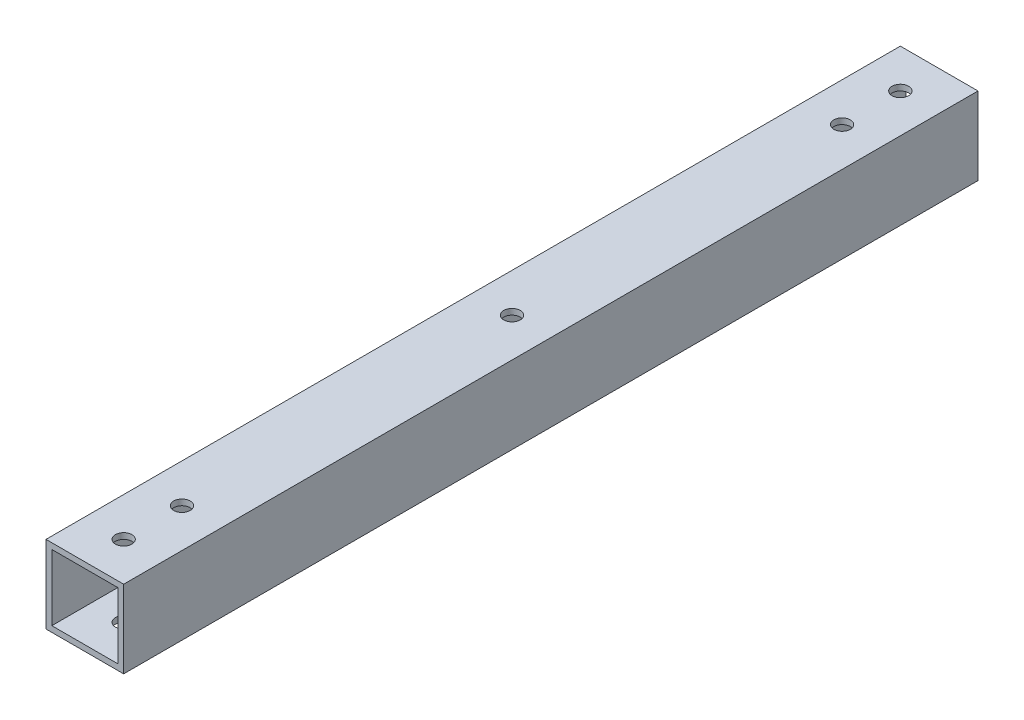
ISO-10303-21;
HEADER;
FILE_DESCRIPTION(('STEP AP214'),'2;1');
FILE_NAME('part.step','',(''),(''),'','','');
FILE_SCHEMA(('AUTOMOTIVE_DESIGN { 1 0 10303 214 1 1 1 1 }'));
ENDSEC;
DATA;
#1=APPLICATION_CONTEXT('core data for automotive mechanical design processes');
#2=APPLICATION_PROTOCOL_DEFINITION('international standard','automotive_design',2000,#1);
#3=PRODUCT_CONTEXT('',#1,'mechanical');
#4=PRODUCT('Part','Part','',(#3));
#5=PRODUCT_RELATED_PRODUCT_CATEGORY('part','',(#4));
#6=PRODUCT_DEFINITION_FORMATION('','',#4);
#7=PRODUCT_DEFINITION_CONTEXT('part definition',#1,'design');
#8=PRODUCT_DEFINITION('design','',#6,#7);
#9=PRODUCT_DEFINITION_SHAPE('','',#8);
#10=(LENGTH_UNIT() NAMED_UNIT(*) SI_UNIT(.MILLI.,.METRE.));
#11=(NAMED_UNIT(*) PLANE_ANGLE_UNIT() SI_UNIT($,.RADIAN.));
#12=(NAMED_UNIT(*) SI_UNIT($,.STERADIAN.) SOLID_ANGLE_UNIT());
#13=UNCERTAINTY_MEASURE_WITH_UNIT(LENGTH_MEASURE(1.E-05),#10,'distance_accuracy_value','');
#14=(GEOMETRIC_REPRESENTATION_CONTEXT(3) GLOBAL_UNCERTAINTY_ASSIGNED_CONTEXT((#13)) GLOBAL_UNIT_ASSIGNED_CONTEXT((#10,
#11,#12)) REPRESENTATION_CONTEXT('',''));
#15=CARTESIAN_POINT('',(0.,0.,0.));
#16=DIRECTION('',(0.,0.,1.));
#17=DIRECTION('',(1.,0.,0.));
#18=AXIS2_PLACEMENT_3D('',#15,#16,#17);
#19=CARTESIAN_POINT('',(10.,-9.99999999999999,-220.));
#20=DIRECTION('',(1.,0.,0.));
#21=DIRECTION('',(0.,0.,-1.));
#22=AXIS2_PLACEMENT_3D('',#19,#20,#21);
#23=PLANE('',#22);
#24=DIRECTION('',(0.,1.,0.));
#25=VECTOR('',#24,1.);
#26=CARTESIAN_POINT('',(10.,-9.99999999999999,0.));
#27=LINE('',#26,#25);
#28=CARTESIAN_POINT('',(10.,-9.99999999999999,0.));
#29=VERTEX_POINT('',#28);
#30=CARTESIAN_POINT('',(10.,10.,0.));
#31=VERTEX_POINT('',#30);
#32=EDGE_CURVE('E142',#29,#31,#27,.T.);
#33=ORIENTED_EDGE('',*,*,#32,.F.);
#34=DIRECTION('',(0.,0.,1.));
#35=VECTOR('',#34,1.);
#36=CARTESIAN_POINT('',(10.,-9.99999999999999,-220.));
#37=LINE('',#36,#35);
#38=CARTESIAN_POINT('',(10.,-9.99999999999999,-220.));
#39=VERTEX_POINT('',#38);
#40=EDGE_CURVE('E11',#39,#29,#37,.T.);
#41=ORIENTED_EDGE('',*,*,#40,.F.);
#42=DIRECTION('',(0.,1.,0.));
#43=VECTOR('',#42,1.);
#44=CARTESIAN_POINT('',(10.,-9.99999999999999,-220.));
#45=LINE('',#44,#43);
#46=CARTESIAN_POINT('',(10.,10.,-220.));
#47=VERTEX_POINT('',#46);
#48=EDGE_CURVE('E146',#39,#47,#45,.T.);
#49=ORIENTED_EDGE('',*,*,#48,.T.);
#50=DIRECTION('',(0.,0.,1.));
#51=VECTOR('',#50,1.);
#52=CARTESIAN_POINT('',(10.,10.,-220.));
#53=LINE('',#52,#51);
#54=EDGE_CURVE('E159',#47,#31,#53,.T.);
#55=ORIENTED_EDGE('',*,*,#54,.T.);
#56=EDGE_LOOP('',(#33,#41,#49,#55));
#57=FACE_BOUND('',#56,.T.);
#58=ADVANCED_FACE('F41',(#57),#23,.T.);
#59=CARTESIAN_POINT('',(-9.99999999999998,-9.99999999999999,-220.));
#60=DIRECTION('',(0.,-1.,0.));
#61=DIRECTION('',(0.,0.,-1.));
#62=AXIS2_PLACEMENT_3D('',#59,#60,#61);
#63=PLANE('',#62);
#64=CARTESIAN_POINT('',(0.,-9.99999999999999,-10.));
#65=DIRECTION('',(0.,1.,0.));
#66=DIRECTION('',(0.,0.,1.));
#67=AXIS2_PLACEMENT_3D('',#64,#65,#66);
#68=CIRCLE('',#67,2.125);
#69=CARTESIAN_POINT('',(0.,-9.99999999999999,-7.875));
#70=VERTEX_POINT('',#69);
#71=EDGE_CURVE('E178',#70,#70,#68,.T.);
#72=ORIENTED_EDGE('',*,*,#71,.T.);
#73=EDGE_LOOP('',(#72));
#74=FACE_BOUND('',#73,.T.);
#75=CARTESIAN_POINT('',(0.,-9.99999999999999,-195.));
#76=DIRECTION('',(0.,1.,0.));
#77=DIRECTION('',(0.,0.,-1.));
#78=AXIS2_PLACEMENT_3D('',#75,#76,#77);
#79=CIRCLE('',#78,2.125);
#80=CARTESIAN_POINT('',(0.,-9.99999999999999,-197.125));
#81=VERTEX_POINT('',#80);
#82=EDGE_CURVE('E215',#81,#81,#79,.T.);
#83=ORIENTED_EDGE('',*,*,#82,.T.);
#84=EDGE_LOOP('',(#83));
#85=FACE_BOUND('',#84,.T.);
#86=CARTESIAN_POINT('',(0.,-9.99999999999999,-25.));
#87=DIRECTION('',(0.,1.,0.));
#88=DIRECTION('',(0.,0.,1.));
#89=AXIS2_PLACEMENT_3D('',#86,#87,#88);
#90=CIRCLE('',#89,2.125);
#91=CARTESIAN_POINT('',(0.,-9.99999999999999,-22.875));
#92=VERTEX_POINT('',#91);
#93=EDGE_CURVE('E221',#92,#92,#90,.T.);
#94=ORIENTED_EDGE('',*,*,#93,.T.);
#95=EDGE_LOOP('',(#94));
#96=FACE_BOUND('',#95,.T.);
#97=CARTESIAN_POINT('',(-6.86049799777153E-13,-9.99999999999999,-210.));
#98=DIRECTION('',(0.,1.,0.));
#99=DIRECTION('',(0.,0.,1.));
#100=AXIS2_PLACEMENT_3D('',#97,#98,#99);
#101=CIRCLE('',#100,2.125);
#102=CARTESIAN_POINT('',(-6.86049799777153E-13,-9.99999999999999,-207.875));
#103=VERTEX_POINT('',#102);
#104=EDGE_CURVE('E201',#103,#103,#101,.T.);
#105=ORIENTED_EDGE('',*,*,#104,.T.);
#106=EDGE_LOOP('',(#105));
#107=FACE_BOUND('',#106,.T.);
#108=CARTESIAN_POINT('',(-3.43024899888577E-13,-9.99999999999999,-110.));
#109=DIRECTION('',(0.,1.,0.));
#110=DIRECTION('',(0.,0.,1.));
#111=AXIS2_PLACEMENT_3D('',#108,#109,#110);
#112=CIRCLE('',#111,2.125);
#113=CARTESIAN_POINT('',(-3.43024899888577E-13,-9.99999999999999,-107.875));
#114=VERTEX_POINT('',#113);
#115=EDGE_CURVE('E208',#114,#114,#112,.T.);
#116=ORIENTED_EDGE('',*,*,#115,.T.);
#117=EDGE_LOOP('',(#116));
#118=FACE_BOUND('',#117,.T.);
#119=DIRECTION('',(1.,0.,0.));
#120=VECTOR('',#119,1.);
#121=CARTESIAN_POINT('',(-9.99999999999998,-9.99999999999999,0.));
#122=LINE('',#121,#120);
#123=CARTESIAN_POINT('',(-9.99999999999998,-9.99999999999999,0.));
#124=VERTEX_POINT('',#123);
#125=EDGE_CURVE('E150',#124,#29,#122,.T.);
#126=ORIENTED_EDGE('',*,*,#125,.F.);
#127=DIRECTION('',(0.,0.,1.));
#128=VECTOR('',#127,1.);
#129=CARTESIAN_POINT('',(-9.99999999999998,-9.99999999999999,-220.));
#130=LINE('',#129,#128);
#131=CARTESIAN_POINT('',(-9.99999999999998,-9.99999999999999,-220.));
#132=VERTEX_POINT('',#131);
#133=EDGE_CURVE('E49',#132,#124,#130,.T.);
#134=ORIENTED_EDGE('',*,*,#133,.F.);
#135=DIRECTION('',(1.,0.,0.));
#136=VECTOR('',#135,1.);
#137=CARTESIAN_POINT('',(-9.99999999999998,-9.99999999999999,-220.));
#138=LINE('',#137,#136);
#139=EDGE_CURVE('E156',#132,#39,#138,.T.);
#140=ORIENTED_EDGE('',*,*,#139,.T.);
#141=ORIENTED_EDGE('',*,*,#40,.T.);
#142=EDGE_LOOP('',(#126,#134,#140,#141));
#143=FACE_BOUND('',#142,.T.);
#144=ADVANCED_FACE('F231',(#74,#85,#96,#107,#118,#143),#63,.T.);
#145=CARTESIAN_POINT('',(-9.99999999999998,-9.99999999999999,-220.));
#146=DIRECTION('',(-1.,0.,0.));
#147=DIRECTION('',(0.,0.,1.));
#148=AXIS2_PLACEMENT_3D('',#145,#146,#147);
#149=PLANE('',#148);
#150=DIRECTION('',(0.,-1.,0.));
#151=VECTOR('',#150,1.);
#152=CARTESIAN_POINT('',(-9.99999999999998,-9.99999999999999,0.));
#153=LINE('',#152,#151);
#154=CARTESIAN_POINT('',(-9.99999999999998,10.,0.));
#155=VERTEX_POINT('',#154);
#156=EDGE_CURVE('E165',#155,#124,#153,.T.);
#157=ORIENTED_EDGE('',*,*,#156,.F.);
#158=DIRECTION('',(0.,0.,1.));
#159=VECTOR('',#158,1.);
#160=CARTESIAN_POINT('',(-9.99999999999998,10.,-220.));
#161=LINE('',#160,#159);
#162=CARTESIAN_POINT('',(-9.99999999999998,10.,-220.));
#163=VERTEX_POINT('',#162);
#164=EDGE_CURVE('E171',#163,#155,#161,.T.);
#165=ORIENTED_EDGE('',*,*,#164,.F.);
#166=DIRECTION('',(0.,-1.,0.));
#167=VECTOR('',#166,1.);
#168=CARTESIAN_POINT('',(-9.99999999999998,-9.99999999999999,-220.));
#169=LINE('',#168,#167);
#170=EDGE_CURVE('E153',#163,#132,#169,.T.);
#171=ORIENTED_EDGE('',*,*,#170,.T.);
#172=ORIENTED_EDGE('',*,*,#133,.T.);
#173=EDGE_LOOP('',(#157,#165,#171,#172));
#174=FACE_BOUND('',#173,.T.);
#175=ADVANCED_FACE('F266',(#174),#149,.T.);
#176=CARTESIAN_POINT('',(-9.99999999999998,10.,-220.));
#177=DIRECTION('',(0.,1.,0.));
#178=DIRECTION('',(0.,0.,1.));
#179=AXIS2_PLACEMENT_3D('',#176,#177,#178);
#180=PLANE('',#179);
#181=CARTESIAN_POINT('',(0.,10.,-10.));
#182=DIRECTION('',(0.,1.,0.));
#183=DIRECTION('',(0.,0.,1.));
#184=AXIS2_PLACEMENT_3D('',#181,#182,#183);
#185=CIRCLE('',#184,2.125);
#186=CARTESIAN_POINT('',(0.,10.,-7.875));
#187=VERTEX_POINT('',#186);
#188=EDGE_CURVE('E214',#187,#187,#185,.T.);
#189=ORIENTED_EDGE('',*,*,#188,.F.);
#190=EDGE_LOOP('',(#189));
#191=FACE_BOUND('',#190,.T.);
#192=CARTESIAN_POINT('',(0.,10.,-195.));
#193=DIRECTION('',(0.,1.,0.));
#194=DIRECTION('',(0.,0.,-1.));
#195=AXIS2_PLACEMENT_3D('',#192,#193,#194);
#196=CIRCLE('',#195,2.125);
#197=CARTESIAN_POINT('',(0.,10.,-197.125));
#198=VERTEX_POINT('',#197);
#199=EDGE_CURVE('E218',#198,#198,#196,.T.);
#200=ORIENTED_EDGE('',*,*,#199,.F.);
#201=EDGE_LOOP('',(#200));
#202=FACE_BOUND('',#201,.T.);
#203=CARTESIAN_POINT('',(0.,10.,-25.));
#204=DIRECTION('',(0.,1.,0.));
#205=DIRECTION('',(0.,0.,1.));
#206=AXIS2_PLACEMENT_3D('',#203,#204,#205);
#207=CIRCLE('',#206,2.125);
#208=CARTESIAN_POINT('',(0.,10.,-22.875));
#209=VERTEX_POINT('',#208);
#210=EDGE_CURVE('E205',#209,#209,#207,.T.);
#211=ORIENTED_EDGE('',*,*,#210,.F.);
#212=EDGE_LOOP('',(#211));
#213=FACE_BOUND('',#212,.T.);
#214=CARTESIAN_POINT('',(-6.86049799777153E-13,10.,-210.));
#215=DIRECTION('',(0.,1.,0.));
#216=DIRECTION('',(0.,0.,1.));
#217=AXIS2_PLACEMENT_3D('',#214,#215,#216);
#218=CIRCLE('',#217,2.125);
#219=CARTESIAN_POINT('',(-6.86049799777153E-13,10.,-207.875));
#220=VERTEX_POINT('',#219);
#221=EDGE_CURVE('E204',#220,#220,#218,.T.);
#222=ORIENTED_EDGE('',*,*,#221,.F.);
#223=EDGE_LOOP('',(#222));
#224=FACE_BOUND('',#223,.T.);
#225=CARTESIAN_POINT('',(-3.43024899888577E-13,10.,-110.));
#226=DIRECTION('',(0.,1.,0.));
#227=DIRECTION('',(0.,0.,1.));
#228=AXIS2_PLACEMENT_3D('',#225,#226,#227);
#229=CIRCLE('',#228,2.125);
#230=CARTESIAN_POINT('',(-3.43024899888577E-13,10.,-107.875));
#231=VERTEX_POINT('',#230);
#232=EDGE_CURVE('E211',#231,#231,#229,.T.);
#233=ORIENTED_EDGE('',*,*,#232,.F.);
#234=EDGE_LOOP('',(#233));
#235=FACE_BOUND('',#234,.T.);
#236=DIRECTION('',(-1.,0.,0.));
#237=VECTOR('',#236,1.);
#238=CARTESIAN_POINT('',(-9.99999999999998,10.,0.));
#239=LINE('',#238,#237);
#240=EDGE_CURVE('E162',#31,#155,#239,.T.);
#241=ORIENTED_EDGE('',*,*,#240,.F.);
#242=ORIENTED_EDGE('',*,*,#54,.F.);
#243=DIRECTION('',(-1.,0.,0.));
#244=VECTOR('',#243,1.);
#245=CARTESIAN_POINT('',(-9.99999999999998,10.,-220.));
#246=LINE('',#245,#244);
#247=EDGE_CURVE('E149',#47,#163,#246,.T.);
#248=ORIENTED_EDGE('',*,*,#247,.T.);
#249=ORIENTED_EDGE('',*,*,#164,.T.);
#250=EDGE_LOOP('',(#241,#242,#248,#249));
#251=FACE_BOUND('',#250,.T.);
#252=ADVANCED_FACE('F280',(#191,#202,#213,#224,#235,#251),#180,.T.);
#253=CARTESIAN_POINT('',(0.,0.,-220.));
#254=DIRECTION('',(0.,0.,-1.));
#255=DIRECTION('',(-1.,0.,0.));
#256=AXIS2_PLACEMENT_3D('',#253,#254,#255);
#257=PLANE('',#256);
#258=DIRECTION('',(0.,-1.,0.));
#259=VECTOR('',#258,1.);
#260=CARTESIAN_POINT('',(-8.49999999999998,-8.49999999999999,-220.));
#261=LINE('',#260,#259);
#262=CARTESIAN_POINT('',(-8.49999999999998,8.50000000000002,-220.));
#263=VERTEX_POINT('',#262);
#264=CARTESIAN_POINT('',(-8.49999999999998,-8.49999999999999,-220.));
#265=VERTEX_POINT('',#264);
#266=EDGE_CURVE('E108',#263,#265,#261,.T.);
#267=ORIENTED_EDGE('',*,*,#266,.T.);
#268=DIRECTION('',(1.,0.,0.));
#269=VECTOR('',#268,1.);
#270=CARTESIAN_POINT('',(-8.49999999999998,-8.49999999999999,-220.));
#271=LINE('',#270,#269);
#272=CARTESIAN_POINT('',(8.50000000000002,-8.49999999999999,-220.));
#273=VERTEX_POINT('',#272);
#274=EDGE_CURVE('E117',#265,#273,#271,.T.);
#275=ORIENTED_EDGE('',*,*,#274,.T.);
#276=DIRECTION('',(0.,1.,0.));
#277=VECTOR('',#276,1.);
#278=CARTESIAN_POINT('',(8.50000000000002,-8.49999999999999,-220.));
#279=LINE('',#278,#277);
#280=CARTESIAN_POINT('',(8.50000000000002,8.50000000000002,-220.));
#281=VERTEX_POINT('',#280);
#282=EDGE_CURVE('E57',#273,#281,#279,.T.);
#283=ORIENTED_EDGE('',*,*,#282,.T.);
#284=DIRECTION('',(-1.,0.,0.));
#285=VECTOR('',#284,1.);
#286=CARTESIAN_POINT('',(-8.49999999999998,8.50000000000002,-220.));
#287=LINE('',#286,#285);
#288=EDGE_CURVE('E114',#281,#263,#287,.T.);
#289=ORIENTED_EDGE('',*,*,#288,.T.);
#290=EDGE_LOOP('',(#267,#275,#283,#289));
#291=FACE_BOUND('',#290,.T.);
#292=ORIENTED_EDGE('',*,*,#48,.F.);
#293=ORIENTED_EDGE('',*,*,#139,.F.);
#294=ORIENTED_EDGE('',*,*,#170,.F.);
#295=ORIENTED_EDGE('',*,*,#247,.F.);
#296=EDGE_LOOP('',(#292,#293,#294,#295));
#297=FACE_BOUND('',#296,.T.);
#298=ADVANCED_FACE('F121',(#291,#297),#257,.T.);
#299=CARTESIAN_POINT('',(0.,0.,0.));
#300=DIRECTION('',(0.,0.,-1.));
#301=DIRECTION('',(-1.,0.,0.));
#302=AXIS2_PLACEMENT_3D('',#299,#300,#301);
#303=PLANE('',#302);
#304=DIRECTION('',(1.,0.,0.));
#305=VECTOR('',#304,1.);
#306=CARTESIAN_POINT('',(-8.49999999999998,-8.49999999999999,0.));
#307=LINE('',#306,#305);
#308=CARTESIAN_POINT('',(-8.49999999999998,-8.49999999999999,0.));
#309=VERTEX_POINT('',#308);
#310=CARTESIAN_POINT('',(8.50000000000002,-8.49999999999999,0.));
#311=VERTEX_POINT('',#310);
#312=EDGE_CURVE('E136',#309,#311,#307,.T.);
#313=ORIENTED_EDGE('',*,*,#312,.F.);
#314=DIRECTION('',(0.,-1.,0.));
#315=VECTOR('',#314,1.);
#316=CARTESIAN_POINT('',(-8.49999999999998,-8.49999999999999,0.));
#317=LINE('',#316,#315);
#318=CARTESIAN_POINT('',(-8.49999999999998,8.50000000000002,0.));
#319=VERTEX_POINT('',#318);
#320=EDGE_CURVE('E65',#319,#309,#317,.T.);
#321=ORIENTED_EDGE('',*,*,#320,.F.);
#322=DIRECTION('',(-1.,0.,0.));
#323=VECTOR('',#322,1.);
#324=CARTESIAN_POINT('',(-8.49999999999998,8.50000000000002,0.));
#325=LINE('',#324,#323);
#326=CARTESIAN_POINT('',(8.50000000000002,8.50000000000002,0.));
#327=VERTEX_POINT('',#326);
#328=EDGE_CURVE('E124',#327,#319,#325,.T.);
#329=ORIENTED_EDGE('',*,*,#328,.F.);
#330=DIRECTION('',(0.,1.,0.));
#331=VECTOR('',#330,1.);
#332=CARTESIAN_POINT('',(8.50000000000002,-8.49999999999999,0.));
#333=LINE('',#332,#331);
#334=EDGE_CURVE('E127',#311,#327,#333,.T.);
#335=ORIENTED_EDGE('',*,*,#334,.F.);
#336=EDGE_LOOP('',(#313,#321,#329,#335));
#337=FACE_BOUND('',#336,.T.);
#338=ORIENTED_EDGE('',*,*,#32,.T.);
#339=ORIENTED_EDGE('',*,*,#240,.T.);
#340=ORIENTED_EDGE('',*,*,#156,.T.);
#341=ORIENTED_EDGE('',*,*,#125,.T.);
#342=EDGE_LOOP('',(#338,#339,#340,#341));
#343=FACE_BOUND('',#342,.T.);
#344=ADVANCED_FACE('F273',(#337,#343),#303,.F.);
#345=CARTESIAN_POINT('',(-8.49999999999998,-8.49999999999999,-220.));
#346=DIRECTION('',(-1.,0.,0.));
#347=DIRECTION('',(0.,0.,1.));
#348=AXIS2_PLACEMENT_3D('',#345,#346,#347);
#349=PLANE('',#348);
#350=ORIENTED_EDGE('',*,*,#320,.T.);
#351=DIRECTION('',(0.,0.,1.));
#352=VECTOR('',#351,1.);
#353=CARTESIAN_POINT('',(-8.49999999999998,-8.49999999999999,-220.));
#354=LINE('',#353,#352);
#355=EDGE_CURVE('E104',#265,#309,#354,.T.);
#356=ORIENTED_EDGE('',*,*,#355,.F.);
#357=ORIENTED_EDGE('',*,*,#266,.F.);
#358=DIRECTION('',(0.,0.,1.));
#359=VECTOR('',#358,1.);
#360=CARTESIAN_POINT('',(-8.49999999999998,8.50000000000002,-220.));
#361=LINE('',#360,#359);
#362=EDGE_CURVE('E140',#263,#319,#361,.T.);
#363=ORIENTED_EDGE('',*,*,#362,.T.);
#364=EDGE_LOOP('',(#350,#356,#357,#363));
#365=FACE_BOUND('',#364,.T.);
#366=ADVANCED_FACE('F106',(#365),#349,.F.);
#367=CARTESIAN_POINT('',(-8.49999999999998,8.50000000000002,-220.));
#368=DIRECTION('',(0.,1.,0.));
#369=DIRECTION('',(0.,0.,1.));
#370=AXIS2_PLACEMENT_3D('',#367,#368,#369);
#371=PLANE('',#370);
#372=CARTESIAN_POINT('',(0.,8.50000000000002,-10.));
#373=DIRECTION('',(0.,1.,0.));
#374=DIRECTION('',(0.,0.,1.));
#375=AXIS2_PLACEMENT_3D('',#372,#373,#374);
#376=CIRCLE('',#375,2.125);
#377=CARTESIAN_POINT('',(0.,8.50000000000002,-7.875));
#378=VERTEX_POINT('',#377);
#379=EDGE_CURVE('E130',#378,#378,#376,.T.);
#380=ORIENTED_EDGE('',*,*,#379,.T.);
#381=EDGE_LOOP('',(#380));
#382=FACE_BOUND('',#381,.T.);
#383=CARTESIAN_POINT('',(0.,8.50000000000002,-195.));
#384=DIRECTION('',(0.,1.,0.));
#385=DIRECTION('',(0.,0.,1.));
#386=AXIS2_PLACEMENT_3D('',#383,#384,#385);
#387=CIRCLE('',#386,2.125);
#388=CARTESIAN_POINT('',(0.,8.50000000000002,-192.875));
#389=VERTEX_POINT('',#388);
#390=EDGE_CURVE('E188',#389,#389,#387,.T.);
#391=ORIENTED_EDGE('',*,*,#390,.T.);
#392=EDGE_LOOP('',(#391));
#393=FACE_BOUND('',#392,.T.);
#394=CARTESIAN_POINT('',(0.,8.50000000000002,-25.));
#395=DIRECTION('',(0.,1.,0.));
#396=DIRECTION('',(0.,0.,1.));
#397=AXIS2_PLACEMENT_3D('',#394,#395,#396);
#398=CIRCLE('',#397,2.125);
#399=CARTESIAN_POINT('',(0.,8.50000000000002,-22.875));
#400=VERTEX_POINT('',#399);
#401=EDGE_CURVE('E185',#400,#400,#398,.T.);
#402=ORIENTED_EDGE('',*,*,#401,.T.);
#403=EDGE_LOOP('',(#402));
#404=FACE_BOUND('',#403,.T.);
#405=CARTESIAN_POINT('',(-6.86049799777153E-13,8.50000000000002,-210.));
#406=DIRECTION('',(0.,1.,0.));
#407=DIRECTION('',(0.,0.,1.));
#408=AXIS2_PLACEMENT_3D('',#405,#406,#407);
#409=CIRCLE('',#408,2.125);
#410=CARTESIAN_POINT('',(-6.86049799777153E-13,8.50000000000002,-207.875));
#411=VERTEX_POINT('',#410);
#412=EDGE_CURVE('E182',#411,#411,#409,.T.);
#413=ORIENTED_EDGE('',*,*,#412,.T.);
#414=EDGE_LOOP('',(#413));
#415=FACE_BOUND('',#414,.T.);
#416=CARTESIAN_POINT('',(-3.43024899888577E-13,8.50000000000002,-110.));
#417=DIRECTION('',(0.,1.,0.));
#418=DIRECTION('',(0.,0.,1.));
#419=AXIS2_PLACEMENT_3D('',#416,#417,#418);
#420=CIRCLE('',#419,2.125);
#421=CARTESIAN_POINT('',(-3.43024899888577E-13,8.50000000000002,-107.875));
#422=VERTEX_POINT('',#421);
#423=EDGE_CURVE('E177',#422,#422,#420,.T.);
#424=ORIENTED_EDGE('',*,*,#423,.T.);
#425=EDGE_LOOP('',(#424));
#426=FACE_BOUND('',#425,.T.);
#427=ORIENTED_EDGE('',*,*,#328,.T.);
#428=ORIENTED_EDGE('',*,*,#362,.F.);
#429=ORIENTED_EDGE('',*,*,#288,.F.);
#430=DIRECTION('',(0.,0.,1.));
#431=VECTOR('',#430,1.);
#432=CARTESIAN_POINT('',(8.50000000000002,8.50000000000002,-220.));
#433=LINE('',#432,#431);
#434=EDGE_CURVE('E143',#281,#327,#433,.T.);
#435=ORIENTED_EDGE('',*,*,#434,.T.);
#436=EDGE_LOOP('',(#427,#428,#429,#435));
#437=FACE_BOUND('',#436,.T.);
#438=ADVANCED_FACE('F247',(#382,#393,#404,#415,#426,#437),#371,.F.);
#439=CARTESIAN_POINT('',(8.50000000000002,-8.49999999999999,-220.));
#440=DIRECTION('',(1.,0.,0.));
#441=DIRECTION('',(0.,0.,-1.));
#442=AXIS2_PLACEMENT_3D('',#439,#440,#441);
#443=PLANE('',#442);
#444=ORIENTED_EDGE('',*,*,#334,.T.);
#445=ORIENTED_EDGE('',*,*,#434,.F.);
#446=ORIENTED_EDGE('',*,*,#282,.F.);
#447=DIRECTION('',(0.,0.,1.));
#448=VECTOR('',#447,1.);
#449=CARTESIAN_POINT('',(8.50000000000002,-8.49999999999999,-220.));
#450=LINE('',#449,#448);
#451=EDGE_CURVE('E113',#273,#311,#450,.T.);
#452=ORIENTED_EDGE('',*,*,#451,.T.);
#453=EDGE_LOOP('',(#444,#445,#446,#452));
#454=FACE_BOUND('',#453,.T.);
#455=ADVANCED_FACE('F298',(#454),#443,.F.);
#456=CARTESIAN_POINT('',(-8.49999999999998,-8.49999999999999,-220.));
#457=DIRECTION('',(0.,-1.,0.));
#458=DIRECTION('',(0.,0.,-1.));
#459=AXIS2_PLACEMENT_3D('',#456,#457,#458);
#460=PLANE('',#459);
#461=CARTESIAN_POINT('',(0.,-8.49999999999999,-10.));
#462=DIRECTION('',(0.,-1.,0.));
#463=DIRECTION('',(0.,0.,-1.));
#464=AXIS2_PLACEMENT_3D('',#461,#462,#463);
#465=CIRCLE('',#464,2.125);
#466=CARTESIAN_POINT('',(0.,-8.49999999999999,-12.125));
#467=VERTEX_POINT('',#466);
#468=EDGE_CURVE('E44',#467,#467,#465,.T.);
#469=ORIENTED_EDGE('',*,*,#468,.T.);
#470=EDGE_LOOP('',(#469));
#471=FACE_BOUND('',#470,.T.);
#472=CARTESIAN_POINT('',(0.,-8.49999999999999,-195.));
#473=DIRECTION('',(0.,-1.,0.));
#474=DIRECTION('',(0.,0.,-1.));
#475=AXIS2_PLACEMENT_3D('',#472,#473,#474);
#476=CIRCLE('',#475,2.125);
#477=CARTESIAN_POINT('',(0.,-8.49999999999999,-197.125));
#478=VERTEX_POINT('',#477);
#479=EDGE_CURVE('E186',#478,#478,#476,.T.);
#480=ORIENTED_EDGE('',*,*,#479,.T.);
#481=EDGE_LOOP('',(#480));
#482=FACE_BOUND('',#481,.T.);
#483=CARTESIAN_POINT('',(0.,-8.49999999999999,-25.));
#484=DIRECTION('',(0.,-1.,0.));
#485=DIRECTION('',(0.,0.,-1.));
#486=AXIS2_PLACEMENT_3D('',#483,#484,#485);
#487=CIRCLE('',#486,2.125);
#488=CARTESIAN_POINT('',(0.,-8.49999999999999,-27.125));
#489=VERTEX_POINT('',#488);
#490=EDGE_CURVE('E183',#489,#489,#487,.T.);
#491=ORIENTED_EDGE('',*,*,#490,.T.);
#492=EDGE_LOOP('',(#491));
#493=FACE_BOUND('',#492,.T.);
#494=CARTESIAN_POINT('',(-6.86049799777153E-13,-8.49999999999999,-210.));
#495=DIRECTION('',(0.,-1.,0.));
#496=DIRECTION('',(0.,0.,-1.));
#497=AXIS2_PLACEMENT_3D('',#494,#495,#496);
#498=CIRCLE('',#497,2.125);
#499=CARTESIAN_POINT('',(-6.86049799777153E-13,-8.49999999999999,-212.125));
#500=VERTEX_POINT('',#499);
#501=EDGE_CURVE('E179',#500,#500,#498,.T.);
#502=ORIENTED_EDGE('',*,*,#501,.T.);
#503=EDGE_LOOP('',(#502));
#504=FACE_BOUND('',#503,.T.);
#505=CARTESIAN_POINT('',(-3.43024899888577E-13,-8.49999999999999,-110.));
#506=DIRECTION('',(0.,-1.,0.));
#507=DIRECTION('',(0.,0.,-1.));
#508=AXIS2_PLACEMENT_3D('',#505,#506,#507);
#509=CIRCLE('',#508,2.125);
#510=CARTESIAN_POINT('',(-3.43024899888577E-13,-8.49999999999999,-112.125));
#511=VERTEX_POINT('',#510);
#512=EDGE_CURVE('E174',#511,#511,#509,.T.);
#513=ORIENTED_EDGE('',*,*,#512,.T.);
#514=EDGE_LOOP('',(#513));
#515=FACE_BOUND('',#514,.T.);
#516=ORIENTED_EDGE('',*,*,#312,.T.);
#517=ORIENTED_EDGE('',*,*,#451,.F.);
#518=ORIENTED_EDGE('',*,*,#274,.F.);
#519=ORIENTED_EDGE('',*,*,#355,.T.);
#520=EDGE_LOOP('',(#516,#517,#518,#519));
#521=FACE_BOUND('',#520,.T.);
#522=ADVANCED_FACE('F118',(#471,#482,#493,#504,#515,#521),#460,.F.);
#523=CARTESIAN_POINT('',(-3.43024899888577E-13,-9.99999999999999,-110.));
#524=DIRECTION('',(0.,1.,0.));
#525=DIRECTION('',(0.,0.,1.));
#526=AXIS2_PLACEMENT_3D('',#523,#524,#525);
#527=CYLINDRICAL_SURFACE('',#526,2.125);
#528=ORIENTED_EDGE('',*,*,#115,.F.);
#529=EDGE_LOOP('',(#528));
#530=FACE_BOUND('',#529,.T.);
#531=ORIENTED_EDGE('',*,*,#512,.F.);
#532=EDGE_LOOP('',(#531));
#533=FACE_BOUND('',#532,.T.);
#534=ADVANCED_FACE('F297',(#530,#533),#527,.F.);
#535=CARTESIAN_POINT('',(-6.86049799777153E-13,-9.99999999999999,-210.));
#536=DIRECTION('',(0.,1.,0.));
#537=DIRECTION('',(0.,0.,1.));
#538=AXIS2_PLACEMENT_3D('',#535,#536,#537);
#539=CYLINDRICAL_SURFACE('',#538,2.125);
#540=ORIENTED_EDGE('',*,*,#104,.F.);
#541=EDGE_LOOP('',(#540));
#542=FACE_BOUND('',#541,.T.);
#543=ORIENTED_EDGE('',*,*,#501,.F.);
#544=EDGE_LOOP('',(#543));
#545=FACE_BOUND('',#544,.T.);
#546=ADVANCED_FACE('F307',(#542,#545),#539,.F.);
#547=CARTESIAN_POINT('',(0.,-9.99999999999999,-25.));
#548=DIRECTION('',(0.,1.,0.));
#549=DIRECTION('',(0.,0.,1.));
#550=AXIS2_PLACEMENT_3D('',#547,#548,#549);
#551=CYLINDRICAL_SURFACE('',#550,2.125);
#552=ORIENTED_EDGE('',*,*,#93,.F.);
#553=EDGE_LOOP('',(#552));
#554=FACE_BOUND('',#553,.T.);
#555=ORIENTED_EDGE('',*,*,#490,.F.);
#556=EDGE_LOOP('',(#555));
#557=FACE_BOUND('',#556,.T.);
#558=ADVANCED_FACE('F312',(#554,#557),#551,.F.);
#559=CARTESIAN_POINT('',(0.,-9.99999999999999,-195.));
#560=DIRECTION('',(0.,1.,0.));
#561=DIRECTION('',(0.,0.,1.));
#562=AXIS2_PLACEMENT_3D('',#559,#560,#561);
#563=CYLINDRICAL_SURFACE('',#562,2.125);
#564=ORIENTED_EDGE('',*,*,#82,.F.);
#565=EDGE_LOOP('',(#564));
#566=FACE_BOUND('',#565,.T.);
#567=ORIENTED_EDGE('',*,*,#479,.F.);
#568=EDGE_LOOP('',(#567));
#569=FACE_BOUND('',#568,.T.);
#570=ADVANCED_FACE('F238',(#566,#569),#563,.F.);
#571=CARTESIAN_POINT('',(0.,-9.99999999999999,-10.));
#572=DIRECTION('',(0.,1.,0.));
#573=DIRECTION('',(0.,0.,1.));
#574=AXIS2_PLACEMENT_3D('',#571,#572,#573);
#575=CYLINDRICAL_SURFACE('',#574,2.125);
#576=ORIENTED_EDGE('',*,*,#71,.F.);
#577=EDGE_LOOP('',(#576));
#578=FACE_BOUND('',#577,.T.);
#579=ORIENTED_EDGE('',*,*,#468,.F.);
#580=EDGE_LOOP('',(#579));
#581=FACE_BOUND('',#580,.T.);
#582=ADVANCED_FACE('F234',(#578,#581),#575,.F.);
#583=ORIENTED_EDGE('',*,*,#232,.T.);
#584=EDGE_LOOP('',(#583));
#585=FACE_BOUND('',#584,.T.);
#586=ORIENTED_EDGE('',*,*,#423,.F.);
#587=EDGE_LOOP('',(#586));
#588=FACE_BOUND('',#587,.T.);
#589=ADVANCED_FACE('F237',(#585,#588),#527,.F.);
#590=ORIENTED_EDGE('',*,*,#221,.T.);
#591=EDGE_LOOP('',(#590));
#592=FACE_BOUND('',#591,.T.);
#593=ORIENTED_EDGE('',*,*,#412,.F.);
#594=EDGE_LOOP('',(#593));
#595=FACE_BOUND('',#594,.T.);
#596=ADVANCED_FACE('F303',(#592,#595),#539,.F.);
#597=ORIENTED_EDGE('',*,*,#210,.T.);
#598=EDGE_LOOP('',(#597));
#599=FACE_BOUND('',#598,.T.);
#600=ORIENTED_EDGE('',*,*,#401,.F.);
#601=EDGE_LOOP('',(#600));
#602=FACE_BOUND('',#601,.T.);
#603=ADVANCED_FACE('F256',(#599,#602),#551,.F.);
#604=ORIENTED_EDGE('',*,*,#199,.T.);
#605=EDGE_LOOP('',(#604));
#606=FACE_BOUND('',#605,.T.);
#607=ORIENTED_EDGE('',*,*,#390,.F.);
#608=EDGE_LOOP('',(#607));
#609=FACE_BOUND('',#608,.T.);
#610=ADVANCED_FACE('F251',(#606,#609),#563,.F.);
#611=ORIENTED_EDGE('',*,*,#188,.T.);
#612=EDGE_LOOP('',(#611));
#613=FACE_BOUND('',#612,.T.);
#614=ORIENTED_EDGE('',*,*,#379,.F.);
#615=EDGE_LOOP('',(#614));
#616=FACE_BOUND('',#615,.T.);
#617=ADVANCED_FACE('F240',(#613,#616),#575,.F.);
#618=CLOSED_SHELL('',(#58,#144,#175,#252,#298,#344,#366,#438,#455,#522,#534,#546,#558,#570,#582,
#589,#596,#603,#610,#617));
#619=MANIFOLD_SOLID_BREP('B2',#618);
#620=ADVANCED_BREP_SHAPE_REPRESENTATION('',(#18,#619),#14);
#621=SHAPE_DEFINITION_REPRESENTATION(#9,#620);
ENDSEC;
END-ISO-10303-21;
